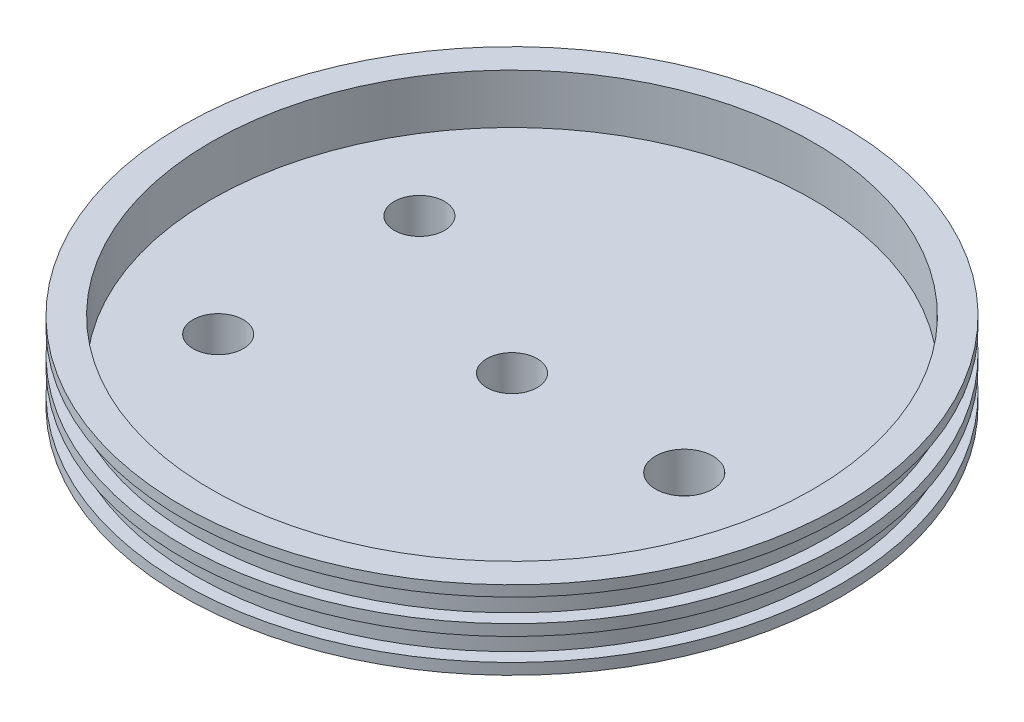
ISO-10303-21;
HEADER;
FILE_DESCRIPTION(('STEP AP214'),'2;1');
FILE_NAME('part.step','',(''),(''),'','','');
FILE_SCHEMA(('AUTOMOTIVE_DESIGN { 1 0 10303 214 1 1 1 1 }'));
ENDSEC;
DATA;
#1=APPLICATION_CONTEXT('core data for automotive mechanical design processes');
#2=APPLICATION_PROTOCOL_DEFINITION('international standard','automotive_design',2000,#1);
#3=PRODUCT_CONTEXT('',#1,'mechanical');
#4=PRODUCT('Part','Part','',(#3));
#5=PRODUCT_RELATED_PRODUCT_CATEGORY('part','',(#4));
#6=PRODUCT_DEFINITION_FORMATION('','',#4);
#7=PRODUCT_DEFINITION_CONTEXT('part definition',#1,'design');
#8=PRODUCT_DEFINITION('design','',#6,#7);
#9=PRODUCT_DEFINITION_SHAPE('','',#8);
#10=(LENGTH_UNIT() NAMED_UNIT(*) SI_UNIT(.MILLI.,.METRE.));
#11=(NAMED_UNIT(*) PLANE_ANGLE_UNIT() SI_UNIT($,.RADIAN.));
#12=(NAMED_UNIT(*) SI_UNIT($,.STERADIAN.) SOLID_ANGLE_UNIT());
#13=UNCERTAINTY_MEASURE_WITH_UNIT(LENGTH_MEASURE(1.E-05),#10,'distance_accuracy_value','');
#14=(GEOMETRIC_REPRESENTATION_CONTEXT(3) GLOBAL_UNCERTAINTY_ASSIGNED_CONTEXT((#13)) GLOBAL_UNIT_ASSIGNED_CONTEXT((#10,
#11,#12)) REPRESENTATION_CONTEXT('',''));
#15=CARTESIAN_POINT('',(0.,0.,0.));
#16=DIRECTION('',(0.,0.,1.));
#17=DIRECTION('',(1.,0.,0.));
#18=AXIS2_PLACEMENT_3D('',#15,#16,#17);
#19=CARTESIAN_POINT('',(0.,0.,0.));
#20=DIRECTION('',(0.,1.,0.));
#21=DIRECTION('',(-1.,0.,0.));
#22=AXIS2_PLACEMENT_3D('',#19,#20,#21);
#23=PLANE('',#22);
#24=CARTESIAN_POINT('',(0.,0.,0.));
#25=DIRECTION('',(0.,-1.,0.));
#26=DIRECTION('',(1.,0.,0.));
#27=AXIS2_PLACEMENT_3D('',#24,#25,#26);
#28=CIRCLE('',#27,66.04);
#29=CARTESIAN_POINT('',(66.04,0.,0.));
#30=VERTEX_POINT('',#29);
#31=EDGE_CURVE('E10',#30,#30,#28,.T.);
#32=ORIENTED_EDGE('',*,*,#31,.F.);
#33=EDGE_LOOP('',(#32));
#34=FACE_BOUND('',#33,.T.);
#35=CARTESIAN_POINT('',(0.,0.,0.));
#36=DIRECTION('',(0.,1.,0.));
#37=DIRECTION('',(-1.,0.,0.));
#38=AXIS2_PLACEMENT_3D('',#35,#36,#37);
#39=CIRCLE('',#38,72.898);
#40=CARTESIAN_POINT('',(-72.898,0.,0.));
#41=VERTEX_POINT('',#40);
#42=EDGE_CURVE('E40',#41,#41,#39,.T.);
#43=ORIENTED_EDGE('',*,*,#42,.F.);
#44=EDGE_LOOP('',(#43));
#45=FACE_BOUND('',#44,.T.);
#46=ADVANCED_FACE('F37',(#34,#45),#23,.F.);
#47=CARTESIAN_POINT('',(0.,48.1922132313012,0.));
#48=DIRECTION('',(0.,1.,0.));
#49=DIRECTION('',(-1.,0.,0.));
#50=AXIS2_PLACEMENT_3D('',#47,#48,#49);
#51=CYLINDRICAL_SURFACE('',#50,72.898);
#52=CARTESIAN_POINT('',(0.,2.4638,0.));
#53=DIRECTION('',(0.,1.,0.));
#54=DIRECTION('',(-1.,0.,0.));
#55=AXIS2_PLACEMENT_3D('',#52,#53,#54);
#56=CIRCLE('',#55,72.898);
#57=CARTESIAN_POINT('',(-72.898,2.46379999999999,0.));
#58=VERTEX_POINT('',#57);
#59=EDGE_CURVE('E48',#58,#58,#56,.T.);
#60=ORIENTED_EDGE('',*,*,#59,.F.);
#61=EDGE_LOOP('',(#60));
#62=FACE_BOUND('',#61,.T.);
#63=ORIENTED_EDGE('',*,*,#42,.T.);
#64=EDGE_LOOP('',(#63));
#65=FACE_BOUND('',#64,.T.);
#66=ADVANCED_FACE('F87',(#62,#65),#51,.T.);
#67=CARTESIAN_POINT('',(72.898,2.4638,0.));
#68=DIRECTION('',(0.,-1.,0.));
#69=DIRECTION('',(1.,0.,0.));
#70=AXIS2_PLACEMENT_3D('',#67,#68,#69);
#71=PLANE('',#70);
#72=CARTESIAN_POINT('',(0.,2.4638,0.));
#73=DIRECTION('',(0.,1.,0.));
#74=DIRECTION('',(-1.,0.,0.));
#75=AXIS2_PLACEMENT_3D('',#72,#73,#74);
#76=CIRCLE('',#75,69.977);
#77=CARTESIAN_POINT('',(-69.977,2.46379999999999,0.));
#78=VERTEX_POINT('',#77);
#79=EDGE_CURVE('E80',#78,#78,#76,.T.);
#80=ORIENTED_EDGE('',*,*,#79,.F.);
#81=EDGE_LOOP('',(#80));
#82=FACE_BOUND('',#81,.T.);
#83=ORIENTED_EDGE('',*,*,#59,.T.);
#84=EDGE_LOOP('',(#83));
#85=FACE_BOUND('',#84,.T.);
#86=ADVANCED_FACE('F85',(#82,#85),#71,.F.);
#87=CARTESIAN_POINT('',(0.,48.1922132313012,0.));
#88=DIRECTION('',(0.,1.,0.));
#89=DIRECTION('',(-1.,0.,0.));
#90=AXIS2_PLACEMENT_3D('',#87,#88,#89);
#91=CYLINDRICAL_SURFACE('',#90,69.977);
#92=CARTESIAN_POINT('',(0.,7.44219999999999,0.));
#93=DIRECTION('',(0.,1.,0.));
#94=DIRECTION('',(-1.,0.,0.));
#95=AXIS2_PLACEMENT_3D('',#92,#93,#94);
#96=CIRCLE('',#95,69.977);
#97=CARTESIAN_POINT('',(-69.977,7.44219999999998,0.));
#98=VERTEX_POINT('',#97);
#99=EDGE_CURVE('E77',#98,#98,#96,.T.);
#100=ORIENTED_EDGE('',*,*,#99,.F.);
#101=EDGE_LOOP('',(#100));
#102=FACE_BOUND('',#101,.T.);
#103=ORIENTED_EDGE('',*,*,#79,.T.);
#104=EDGE_LOOP('',(#103));
#105=FACE_BOUND('',#104,.T.);
#106=ADVANCED_FACE('F240',(#102,#105),#91,.T.);
#107=CARTESIAN_POINT('',(69.977,7.4422,0.));
#108=DIRECTION('',(0.,1.,0.));
#109=DIRECTION('',(-1.,0.,0.));
#110=AXIS2_PLACEMENT_3D('',#107,#108,#109);
#111=PLANE('',#110);
#112=CARTESIAN_POINT('',(0.,7.44219999999999,0.));
#113=DIRECTION('',(0.,1.,0.));
#114=DIRECTION('',(-1.,0.,0.));
#115=AXIS2_PLACEMENT_3D('',#112,#113,#114);
#116=CIRCLE('',#115,72.898);
#117=CARTESIAN_POINT('',(-72.898,7.44219999999998,0.));
#118=VERTEX_POINT('',#117);
#119=EDGE_CURVE('E74',#118,#118,#116,.T.);
#120=ORIENTED_EDGE('',*,*,#119,.F.);
#121=EDGE_LOOP('',(#120));
#122=FACE_BOUND('',#121,.T.);
#123=ORIENTED_EDGE('',*,*,#99,.T.);
#124=EDGE_LOOP('',(#123));
#125=FACE_BOUND('',#124,.T.);
#126=ADVANCED_FACE('F231',(#122,#125),#111,.F.);
#127=CARTESIAN_POINT('',(0.,48.1922132313012,0.));
#128=DIRECTION('',(0.,1.,0.));
#129=DIRECTION('',(-1.,0.,0.));
#130=AXIS2_PLACEMENT_3D('',#127,#128,#129);
#131=CYLINDRICAL_SURFACE('',#130,72.898);
#132=CARTESIAN_POINT('',(0.,9.90599999999999,0.));
#133=DIRECTION('',(0.,1.,0.));
#134=DIRECTION('',(-1.,0.,0.));
#135=AXIS2_PLACEMENT_3D('',#132,#133,#134);
#136=CIRCLE('',#135,72.898);
#137=CARTESIAN_POINT('',(-72.898,9.90599999999998,0.));
#138=VERTEX_POINT('',#137);
#139=EDGE_CURVE('E71',#138,#138,#136,.T.);
#140=ORIENTED_EDGE('',*,*,#139,.F.);
#141=EDGE_LOOP('',(#140));
#142=FACE_BOUND('',#141,.T.);
#143=ORIENTED_EDGE('',*,*,#119,.T.);
#144=EDGE_LOOP('',(#143));
#145=FACE_BOUND('',#144,.T.);
#146=ADVANCED_FACE('F222',(#142,#145),#131,.T.);
#147=CARTESIAN_POINT('',(72.898,9.906,0.));
#148=DIRECTION('',(0.,-1.,0.));
#149=DIRECTION('',(1.,0.,0.));
#150=AXIS2_PLACEMENT_3D('',#147,#148,#149);
#151=PLANE('',#150);
#152=CARTESIAN_POINT('',(0.,9.90599999999999,0.));
#153=DIRECTION('',(0.,1.,0.));
#154=DIRECTION('',(-1.,0.,0.));
#155=AXIS2_PLACEMENT_3D('',#152,#153,#154);
#156=CIRCLE('',#155,69.977);
#157=CARTESIAN_POINT('',(-69.977,9.90599999999998,0.));
#158=VERTEX_POINT('',#157);
#159=EDGE_CURVE('E68',#158,#158,#156,.T.);
#160=ORIENTED_EDGE('',*,*,#159,.F.);
#161=EDGE_LOOP('',(#160));
#162=FACE_BOUND('',#161,.T.);
#163=ORIENTED_EDGE('',*,*,#139,.T.);
#164=EDGE_LOOP('',(#163));
#165=FACE_BOUND('',#164,.T.);
#166=ADVANCED_FACE('F213',(#162,#165),#151,.F.);
#167=CARTESIAN_POINT('',(0.,48.1922132313012,0.));
#168=DIRECTION('',(0.,1.,0.));
#169=DIRECTION('',(-1.,0.,0.));
#170=AXIS2_PLACEMENT_3D('',#167,#168,#169);
#171=CYLINDRICAL_SURFACE('',#170,69.977);
#172=CARTESIAN_POINT('',(0.,14.986,0.));
#173=DIRECTION('',(0.,1.,0.));
#174=DIRECTION('',(-1.,0.,0.));
#175=AXIS2_PLACEMENT_3D('',#172,#173,#174);
#176=CIRCLE('',#175,69.977);
#177=CARTESIAN_POINT('',(-69.977,14.986,0.));
#178=VERTEX_POINT('',#177);
#179=EDGE_CURVE('E65',#178,#178,#176,.T.);
#180=ORIENTED_EDGE('',*,*,#179,.F.);
#181=EDGE_LOOP('',(#180));
#182=FACE_BOUND('',#181,.T.);
#183=ORIENTED_EDGE('',*,*,#159,.T.);
#184=EDGE_LOOP('',(#183));
#185=FACE_BOUND('',#184,.T.);
#186=ADVANCED_FACE('F204',(#182,#185),#171,.T.);
#187=CARTESIAN_POINT('',(69.977,14.986,0.));
#188=DIRECTION('',(0.,1.,0.));
#189=DIRECTION('',(-1.,0.,0.));
#190=AXIS2_PLACEMENT_3D('',#187,#188,#189);
#191=PLANE('',#190);
#192=CARTESIAN_POINT('',(0.,14.986,0.));
#193=DIRECTION('',(0.,1.,0.));
#194=DIRECTION('',(-1.,0.,0.));
#195=AXIS2_PLACEMENT_3D('',#192,#193,#194);
#196=CIRCLE('',#195,72.898);
#197=CARTESIAN_POINT('',(-72.898,14.986,0.));
#198=VERTEX_POINT('',#197);
#199=EDGE_CURVE('E62',#198,#198,#196,.T.);
#200=ORIENTED_EDGE('',*,*,#199,.F.);
#201=EDGE_LOOP('',(#200));
#202=FACE_BOUND('',#201,.T.);
#203=ORIENTED_EDGE('',*,*,#179,.T.);
#204=EDGE_LOOP('',(#203));
#205=FACE_BOUND('',#204,.T.);
#206=ADVANCED_FACE('F195',(#202,#205),#191,.F.);
#207=CARTESIAN_POINT('',(0.,48.1922132313012,0.));
#208=DIRECTION('',(0.,1.,0.));
#209=DIRECTION('',(-1.,0.,0.));
#210=AXIS2_PLACEMENT_3D('',#207,#208,#209);
#211=CYLINDRICAL_SURFACE('',#210,72.898);
#212=CARTESIAN_POINT('',(0.,17.3482,0.));
#213=DIRECTION('',(0.,1.,0.));
#214=DIRECTION('',(-1.,0.,0.));
#215=AXIS2_PLACEMENT_3D('',#212,#213,#214);
#216=CIRCLE('',#215,72.898);
#217=CARTESIAN_POINT('',(-72.898,17.3482,0.));
#218=VERTEX_POINT('',#217);
#219=EDGE_CURVE('E59',#218,#218,#216,.T.);
#220=ORIENTED_EDGE('',*,*,#219,.F.);
#221=EDGE_LOOP('',(#220));
#222=FACE_BOUND('',#221,.T.);
#223=ORIENTED_EDGE('',*,*,#199,.T.);
#224=EDGE_LOOP('',(#223));
#225=FACE_BOUND('',#224,.T.);
#226=ADVANCED_FACE('F186',(#222,#225),#211,.T.);
#227=CARTESIAN_POINT('',(72.898,17.3482,0.));
#228=DIRECTION('',(0.,-1.,0.));
#229=DIRECTION('',(1.,0.,0.));
#230=AXIS2_PLACEMENT_3D('',#227,#228,#229);
#231=PLANE('',#230);
#232=CARTESIAN_POINT('',(0.,17.3482,0.));
#233=DIRECTION('',(0.,1.,0.));
#234=DIRECTION('',(-1.,0.,0.));
#235=AXIS2_PLACEMENT_3D('',#232,#233,#234);
#236=CIRCLE('',#235,66.548);
#237=CARTESIAN_POINT('',(-66.548,17.3482,0.));
#238=VERTEX_POINT('',#237);
#239=EDGE_CURVE('E56',#238,#238,#236,.T.);
#240=ORIENTED_EDGE('',*,*,#239,.F.);
#241=EDGE_LOOP('',(#240));
#242=FACE_BOUND('',#241,.T.);
#243=ORIENTED_EDGE('',*,*,#219,.T.);
#244=EDGE_LOOP('',(#243));
#245=FACE_BOUND('',#244,.T.);
#246=ADVANCED_FACE('F178',(#242,#245),#231,.F.);
#247=CARTESIAN_POINT('',(0.,48.1922132313012,0.));
#248=DIRECTION('',(0.,1.,0.));
#249=DIRECTION('',(-1.,0.,0.));
#250=AXIS2_PLACEMENT_3D('',#247,#248,#249);
#251=CYLINDRICAL_SURFACE('',#250,66.548);
#252=CARTESIAN_POINT('',(0.,6.34999999999999,0.));
#253=DIRECTION('',(0.,1.,0.));
#254=DIRECTION('',(-1.,0.,0.));
#255=AXIS2_PLACEMENT_3D('',#252,#253,#254);
#256=CIRCLE('',#255,66.548);
#257=CARTESIAN_POINT('',(-66.548,6.34999999999999,0.));
#258=VERTEX_POINT('',#257);
#259=EDGE_CURVE('E53',#258,#258,#256,.T.);
#260=ORIENTED_EDGE('',*,*,#259,.F.);
#261=EDGE_LOOP('',(#260));
#262=FACE_BOUND('',#261,.T.);
#263=ORIENTED_EDGE('',*,*,#239,.T.);
#264=EDGE_LOOP('',(#263));
#265=FACE_BOUND('',#264,.T.);
#266=ADVANCED_FACE('F102',(#262,#265),#251,.F.);
#267=CARTESIAN_POINT('',(66.548,6.35,0.));
#268=DIRECTION('',(0.,-1.,0.));
#269=DIRECTION('',(1.,0.,0.));
#270=AXIS2_PLACEMENT_3D('',#267,#268,#269);
#271=PLANE('',#270);
#272=CARTESIAN_POINT('',(-39.9614272550934,6.34999999999999,25.031151170964));
#273=DIRECTION('',(0.,-1.,0.));
#274=DIRECTION('',(1.,0.,0.));
#275=AXIS2_PLACEMENT_3D('',#272,#273,#274);
#276=CIRCLE('',#275,5.56259999999999);
#277=CARTESIAN_POINT('',(-34.3988272550935,6.34999999999999,25.031151170964));
#278=VERTEX_POINT('',#277);
#279=EDGE_CURVE('E301',#278,#278,#276,.T.);
#280=ORIENTED_EDGE('',*,*,#279,.T.);
#281=EDGE_LOOP('',(#280));
#282=FACE_BOUND('',#281,.T.);
#283=CARTESIAN_POINT('',(-40.3580412289557,6.34999999999999,-19.8786251993397));
#284=DIRECTION('',(0.,-1.,0.));
#285=DIRECTION('',(1.,0.,0.));
#286=AXIS2_PLACEMENT_3D('',#283,#284,#285);
#287=CIRCLE('',#286,5.56259999999999);
#288=CARTESIAN_POINT('',(-34.7954412289557,6.34999999999999,-19.8786251993397));
#289=VERTEX_POINT('',#288);
#290=EDGE_CURVE('E305',#289,#289,#287,.T.);
#291=ORIENTED_EDGE('',*,*,#290,.T.);
#292=EDGE_LOOP('',(#291));
#293=FACE_BOUND('',#292,.T.);
#294=CARTESIAN_POINT('',(38.1,6.35,0.));
#295=DIRECTION('',(0.,-1.,0.));
#296=DIRECTION('',(1.,0.,0.));
#297=AXIS2_PLACEMENT_3D('',#294,#295,#296);
#298=CIRCLE('',#297,6.35);
#299=CARTESIAN_POINT('',(44.45,6.35,0.));
#300=VERTEX_POINT('',#299);
#301=EDGE_CURVE('E314',#300,#300,#298,.T.);
#302=ORIENTED_EDGE('',*,*,#301,.T.);
#303=EDGE_LOOP('',(#302));
#304=FACE_BOUND('',#303,.T.);
#305=CARTESIAN_POINT('',(0.,6.35,0.));
#306=DIRECTION('',(0.,1.,0.));
#307=DIRECTION('',(0.,0.,1.));
#308=AXIS2_PLACEMENT_3D('',#305,#306,#307);
#309=CIRCLE('',#308,5.56259999999999);
#310=CARTESIAN_POINT('',(0.,6.35,5.56259999999999));
#311=VERTEX_POINT('',#310);
#312=EDGE_CURVE('E317',#311,#311,#309,.T.);
#313=ORIENTED_EDGE('',*,*,#312,.F.);
#314=EDGE_LOOP('',(#313));
#315=FACE_BOUND('',#314,.T.);
#316=ORIENTED_EDGE('',*,*,#259,.T.);
#317=EDGE_LOOP('',(#316));
#318=FACE_BOUND('',#317,.T.);
#319=ADVANCED_FACE('F111',(#282,#293,#304,#315,#318),#271,.F.);
#320=CARTESIAN_POINT('',(0.,-2.54,0.));
#321=DIRECTION('',(0.,1.,0.));
#322=DIRECTION('',(-1.,0.,0.));
#323=AXIS2_PLACEMENT_3D('',#320,#321,#322);
#324=CYLINDRICAL_SURFACE('',#323,66.04);
#325=CARTESIAN_POINT('',(0.,-2.54,0.));
#326=DIRECTION('',(0.,-1.,0.));
#327=DIRECTION('',(1.,0.,0.));
#328=AXIS2_PLACEMENT_3D('',#325,#326,#327);
#329=CIRCLE('',#328,66.04);
#330=CARTESIAN_POINT('',(66.04,-2.53999999999999,0.));
#331=VERTEX_POINT('',#330);
#332=EDGE_CURVE('E51',#331,#331,#329,.T.);
#333=ORIENTED_EDGE('',*,*,#332,.F.);
#334=EDGE_LOOP('',(#333));
#335=FACE_BOUND('',#334,.T.);
#336=ORIENTED_EDGE('',*,*,#31,.T.);
#337=EDGE_LOOP('',(#336));
#338=FACE_BOUND('',#337,.T.);
#339=ADVANCED_FACE('F106',(#335,#338),#324,.T.);
#340=CARTESIAN_POINT('',(0.,-2.54,0.));
#341=DIRECTION('',(0.,-1.,0.));
#342=DIRECTION('',(1.,0.,0.));
#343=AXIS2_PLACEMENT_3D('',#340,#341,#342);
#344=PLANE('',#343);
#345=CARTESIAN_POINT('',(-39.9614272550934,-2.54000000000001,25.031151170964));
#346=DIRECTION('',(0.,-1.,0.));
#347=DIRECTION('',(0.,0.,-1.));
#348=AXIS2_PLACEMENT_3D('',#345,#346,#347);
#349=CIRCLE('',#348,5.56259999999999);
#350=CARTESIAN_POINT('',(-39.9614272550934,-2.54000000000001,19.468551170964));
#351=VERTEX_POINT('',#350);
#352=EDGE_CURVE('E298',#351,#351,#349,.T.);
#353=ORIENTED_EDGE('',*,*,#352,.F.);
#354=EDGE_LOOP('',(#353));
#355=FACE_BOUND('',#354,.T.);
#356=CARTESIAN_POINT('',(-40.3580412289557,-2.54000000000001,-19.8786251993397));
#357=DIRECTION('',(0.,-1.,0.));
#358=DIRECTION('',(0.,0.,-1.));
#359=AXIS2_PLACEMENT_3D('',#356,#357,#358);
#360=CIRCLE('',#359,5.56259999999999);
#361=CARTESIAN_POINT('',(-40.3580412289557,-2.54000000000001,-25.4412251993397));
#362=VERTEX_POINT('',#361);
#363=EDGE_CURVE('E302',#362,#362,#360,.T.);
#364=ORIENTED_EDGE('',*,*,#363,.F.);
#365=EDGE_LOOP('',(#364));
#366=FACE_BOUND('',#365,.T.);
#367=CARTESIAN_POINT('',(38.1,-2.54,0.));
#368=DIRECTION('',(0.,-1.,0.));
#369=DIRECTION('',(1.,0.,0.));
#370=AXIS2_PLACEMENT_3D('',#367,#368,#369);
#371=CIRCLE('',#370,6.35);
#372=CARTESIAN_POINT('',(44.45,-2.53999999999999,0.));
#373=VERTEX_POINT('',#372);
#374=EDGE_CURVE('E311',#373,#373,#371,.T.);
#375=ORIENTED_EDGE('',*,*,#374,.F.);
#376=EDGE_LOOP('',(#375));
#377=FACE_BOUND('',#376,.T.);
#378=CARTESIAN_POINT('',(0.,-2.54,0.));
#379=DIRECTION('',(0.,1.,0.));
#380=DIRECTION('',(0.,0.,1.));
#381=AXIS2_PLACEMENT_3D('',#378,#379,#380);
#382=CIRCLE('',#381,5.5626);
#383=CARTESIAN_POINT('',(0.,-2.54,5.5626));
#384=VERTEX_POINT('',#383);
#385=EDGE_CURVE('E319',#384,#384,#382,.T.);
#386=ORIENTED_EDGE('',*,*,#385,.T.);
#387=EDGE_LOOP('',(#386));
#388=FACE_BOUND('',#387,.T.);
#389=ORIENTED_EDGE('',*,*,#332,.T.);
#390=EDGE_LOOP('',(#389));
#391=FACE_BOUND('',#390,.T.);
#392=ADVANCED_FACE('F110',(#355,#366,#377,#388,#391),#344,.T.);
#393=CARTESIAN_POINT('',(0.,6.35,0.));
#394=DIRECTION('',(0.,1.,0.));
#395=DIRECTION('',(0.,0.,1.));
#396=AXIS2_PLACEMENT_3D('',#393,#394,#395);
#397=CYLINDRICAL_SURFACE('',#396,5.56259999999999);
#398=ORIENTED_EDGE('',*,*,#385,.F.);
#399=EDGE_LOOP('',(#398));
#400=FACE_BOUND('',#399,.T.);
#401=ORIENTED_EDGE('',*,*,#312,.T.);
#402=EDGE_LOOP('',(#401));
#403=FACE_BOUND('',#402,.T.);
#404=ADVANCED_FACE('F119',(#400,#403),#397,.F.);
#405=CARTESIAN_POINT('',(38.1,17.3482,0.));
#406=DIRECTION('',(0.,-1.,0.));
#407=DIRECTION('',(1.,0.,0.));
#408=AXIS2_PLACEMENT_3D('',#405,#406,#407);
#409=CYLINDRICAL_SURFACE('',#408,6.35);
#410=ORIENTED_EDGE('',*,*,#374,.T.);
#411=EDGE_LOOP('',(#410));
#412=FACE_BOUND('',#411,.T.);
#413=ORIENTED_EDGE('',*,*,#301,.F.);
#414=EDGE_LOOP('',(#413));
#415=FACE_BOUND('',#414,.T.);
#416=ADVANCED_FACE('F123',(#412,#415),#409,.F.);
#417=CARTESIAN_POINT('',(-40.3580412289557,-2.54,-19.8786251993397));
#418=DIRECTION('',(0.,-1.,0.));
#419=DIRECTION('',(0.,0.,-1.));
#420=AXIS2_PLACEMENT_3D('',#417,#418,#419);
#421=CYLINDRICAL_SURFACE('',#420,5.56259999999999);
#422=ORIENTED_EDGE('',*,*,#363,.T.);
#423=EDGE_LOOP('',(#422));
#424=FACE_BOUND('',#423,.T.);
#425=ORIENTED_EDGE('',*,*,#290,.F.);
#426=EDGE_LOOP('',(#425));
#427=FACE_BOUND('',#426,.T.);
#428=ADVANCED_FACE('F132',(#424,#427),#421,.F.);
#429=CARTESIAN_POINT('',(-39.9614272550934,-2.54,25.031151170964));
#430=DIRECTION('',(0.,-1.,0.));
#431=DIRECTION('',(0.,0.,-1.));
#432=AXIS2_PLACEMENT_3D('',#429,#430,#431);
#433=CYLINDRICAL_SURFACE('',#432,5.56259999999999);
#434=ORIENTED_EDGE('',*,*,#352,.T.);
#435=EDGE_LOOP('',(#434));
#436=FACE_BOUND('',#435,.T.);
#437=ORIENTED_EDGE('',*,*,#279,.F.);
#438=EDGE_LOOP('',(#437));
#439=FACE_BOUND('',#438,.T.);
#440=ADVANCED_FACE('F141',(#436,#439),#433,.F.);
#441=CLOSED_SHELL('',(#46,#66,#86,#106,#126,#146,#166,#186,#206,#226,#246,#266,#319,#339,#392,
#404,#416,#428,#440));
#442=MANIFOLD_SOLID_BREP('B2',#441);
#443=ADVANCED_BREP_SHAPE_REPRESENTATION('',(#18,#442),#14);
#444=SHAPE_DEFINITION_REPRESENTATION(#9,#443);
ENDSEC;
END-ISO-10303-21;
